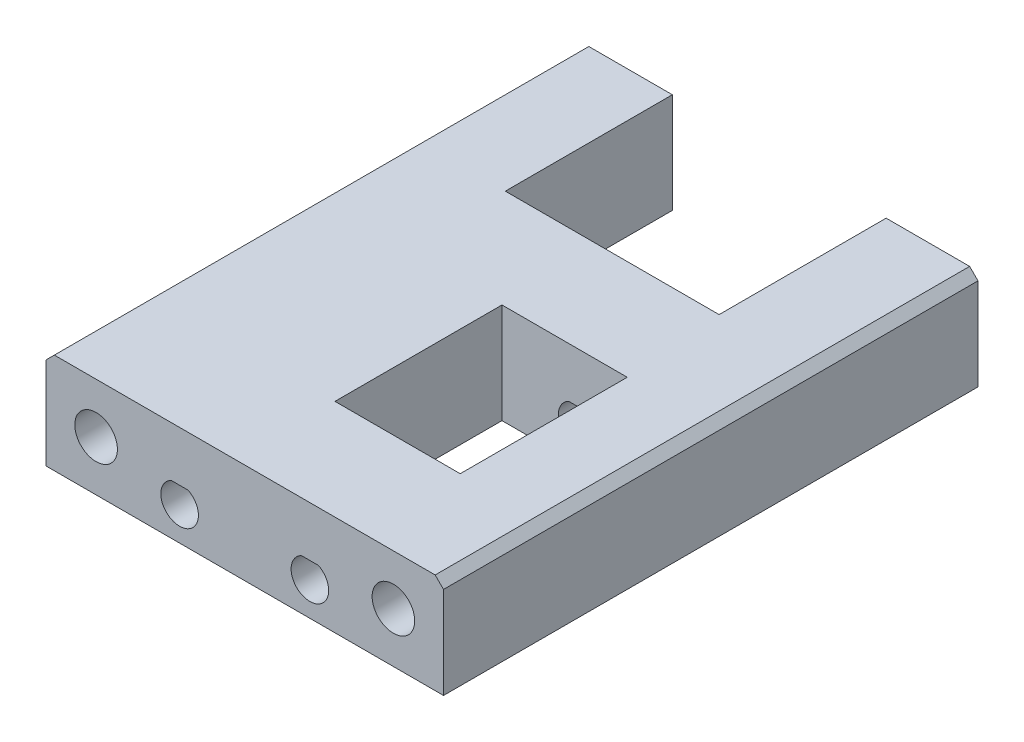
ISO-10303-21;
HEADER;
FILE_DESCRIPTION(('STEP AP214'),'2;1');
FILE_NAME('part.step','',(''),(''),'','','');
FILE_SCHEMA(('AUTOMOTIVE_DESIGN { 1 0 10303 214 1 1 1 1 }'));
ENDSEC;
DATA;
#1=APPLICATION_CONTEXT('core data for automotive mechanical design processes');
#2=APPLICATION_PROTOCOL_DEFINITION('international standard','automotive_design',2000,#1);
#3=PRODUCT_CONTEXT('',#1,'mechanical');
#4=PRODUCT('Part','Part','',(#3));
#5=PRODUCT_RELATED_PRODUCT_CATEGORY('part','',(#4));
#6=PRODUCT_DEFINITION_FORMATION('','',#4);
#7=PRODUCT_DEFINITION_CONTEXT('part definition',#1,'design');
#8=PRODUCT_DEFINITION('design','',#6,#7);
#9=PRODUCT_DEFINITION_SHAPE('','',#8);
#10=(LENGTH_UNIT() NAMED_UNIT(*) SI_UNIT(.MILLI.,.METRE.));
#11=(NAMED_UNIT(*) PLANE_ANGLE_UNIT() SI_UNIT($,.RADIAN.));
#12=(NAMED_UNIT(*) SI_UNIT($,.STERADIAN.) SOLID_ANGLE_UNIT());
#13=UNCERTAINTY_MEASURE_WITH_UNIT(LENGTH_MEASURE(1.E-05),#10,'distance_accuracy_value','');
#14=(GEOMETRIC_REPRESENTATION_CONTEXT(3) GLOBAL_UNCERTAINTY_ASSIGNED_CONTEXT((#13)) GLOBAL_UNIT_ASSIGNED_CONTEXT((#10,
#11,#12)) REPRESENTATION_CONTEXT('',''));
#15=CARTESIAN_POINT('',(0.,0.,0.));
#16=DIRECTION('',(0.,0.,1.));
#17=DIRECTION('',(1.,0.,0.));
#18=AXIS2_PLACEMENT_3D('',#15,#16,#17);
#19=CARTESIAN_POINT('',(8.55,6.,-67.9766609926118));
#20=DIRECTION('',(0.,-1.,0.));
#21=DIRECTION('',(0.,0.,-1.));
#22=AXIS2_PLACEMENT_3D('',#19,#20,#21);
#23=PLANE('',#22);
#24=DIRECTION('',(1.,0.,0.));
#25=VECTOR('',#24,1.);
#26=CARTESIAN_POINT('',(8.54999999999999,6.,12.));
#27=LINE('',#26,#25);
#28=CARTESIAN_POINT('',(30.5692235935956,6.,12.));
#29=VERTEX_POINT('',#28);
#30=CARTESIAN_POINT('',(32.6307764064044,6.,12.));
#31=VERTEX_POINT('',#30);
#32=EDGE_CURVE('E55',#29,#31,#27,.T.);
#33=ORIENTED_EDGE('',*,*,#32,.F.);
#34=DIRECTION('',(0.,0.,1.));
#35=VECTOR('',#34,1.);
#36=CARTESIAN_POINT('',(30.5692235935956,6.,0.));
#37=LINE('',#36,#35);
#38=CARTESIAN_POINT('',(30.5692235935956,6.,0.));
#39=VERTEX_POINT('',#38);
#40=EDGE_CURVE('E266',#29,#39,#37,.F.);
#41=ORIENTED_EDGE('',*,*,#40,.T.);
#42=DIRECTION('',(-1.,0.,0.));
#43=VECTOR('',#42,1.);
#44=CARTESIAN_POINT('',(11.,6.,0.));
#45=LINE('',#44,#43);
#46=CARTESIAN_POINT('',(32.6307764064044,6.00000000000001,0.));
#47=VERTEX_POINT('',#46);
#48=EDGE_CURVE('E221',#47,#39,#45,.T.);
#49=ORIENTED_EDGE('',*,*,#48,.F.);
#50=DIRECTION('',(0.,0.,1.));
#51=VECTOR('',#50,1.);
#52=CARTESIAN_POINT('',(32.6307764064044,6.,0.));
#53=LINE('',#52,#51);
#54=EDGE_CURVE('E273',#47,#31,#53,.T.);
#55=ORIENTED_EDGE('',*,*,#54,.T.);
#56=EDGE_LOOP('',(#33,#41,#49,#55));
#57=FACE_BOUND('',#56,.T.);
#58=ADVANCED_FACE('F33',(#57),#23,.T.);
#59=CARTESIAN_POINT('',(31.6,4.,0.));
#60=DIRECTION('',(0.,0.,1.));
#61=DIRECTION('',(1.,0.,0.));
#62=AXIS2_PLACEMENT_3D('',#59,#60,#61);
#63=CYLINDRICAL_SURFACE('',#62,2.25);
#64=ORIENTED_EDGE('',*,*,#40,.F.);
#65=CARTESIAN_POINT('',(31.6,4.,12.));
#66=DIRECTION('',(0.,0.,-1.));
#67=DIRECTION('',(-1.,0.,0.));
#68=AXIS2_PLACEMENT_3D('',#65,#66,#67);
#69=CIRCLE('',#68,2.25);
#70=EDGE_CURVE('E213',#29,#31,#69,.F.);
#71=ORIENTED_EDGE('',*,*,#70,.T.);
#72=ORIENTED_EDGE('',*,*,#54,.F.);
#73=CARTESIAN_POINT('',(31.6,4.,0.));
#74=DIRECTION('',(0.,0.,1.));
#75=DIRECTION('',(1.,0.,0.));
#76=AXIS2_PLACEMENT_3D('',#73,#74,#75);
#77=CIRCLE('',#76,2.25);
#78=EDGE_CURVE('E303',#39,#47,#77,.T.);
#79=ORIENTED_EDGE('',*,*,#78,.F.);
#80=EDGE_LOOP('',(#64,#71,#72,#79));
#81=FACE_BOUND('',#80,.T.);
#82=ADVANCED_FACE('F394',(#81),#63,.F.);
#83=CARTESIAN_POINT('',(6.,6.,-20.));
#84=DIRECTION('',(0.,0.,-1.));
#85=DIRECTION('',(-1.,0.,0.));
#86=AXIS2_PLACEMENT_3D('',#83,#84,#85);
#87=PLANE('',#86);
#88=CARTESIAN_POINT('',(6.,6.,-20.));
#89=DIRECTION('',(0.,0.,-1.));
#90=DIRECTION('',(-1.,0.,0.));
#91=AXIS2_PLACEMENT_3D('',#88,#89,#90);
#92=CIRCLE('',#91,3.42488663525923);
#93=CARTESIAN_POINT('',(2.57511336474077,6.,-20.));
#94=VERTEX_POINT('',#93);
#95=EDGE_CURVE('E315',#94,#94,#92,.F.);
#96=ORIENTED_EDGE('',*,*,#95,.T.);
#97=EDGE_LOOP('',(#96));
#98=FACE_BOUND('',#97,.T.);
#99=DIRECTION('',(0.,1.,0.));
#100=VECTOR('',#99,1.);
#101=CARTESIAN_POINT('',(0.,0.,-20.));
#102=LINE('',#101,#100);
#103=CARTESIAN_POINT('',(0.,0.,-20.));
#104=VERTEX_POINT('',#103);
#105=CARTESIAN_POINT('',(0.,11.,-20.));
#106=VERTEX_POINT('',#105);
#107=EDGE_CURVE('E255',#104,#106,#102,.T.);
#108=ORIENTED_EDGE('',*,*,#107,.T.);
#109=DIRECTION('',(0.707106781186545,0.70710678118655,0.));
#110=VECTOR('',#109,1.);
#111=CARTESIAN_POINT('',(0.49999999999998,11.5,-20.));
#112=LINE('',#111,#110);
#113=CARTESIAN_POINT('',(0.999999999999994,12.,-20.));
#114=VERTEX_POINT('',#113);
#115=EDGE_CURVE('E332',#106,#114,#112,.T.);
#116=ORIENTED_EDGE('',*,*,#115,.T.);
#117=DIRECTION('',(-1.,0.,0.));
#118=VECTOR('',#117,1.);
#119=CARTESIAN_POINT('',(0.,12.,-20.));
#120=LINE('',#119,#118);
#121=CARTESIAN_POINT('',(11.,12.,-20.));
#122=VERTEX_POINT('',#121);
#123=EDGE_CURVE('E232',#122,#114,#120,.T.);
#124=ORIENTED_EDGE('',*,*,#123,.F.);
#125=DIRECTION('',(0.,-1.,0.));
#126=VECTOR('',#125,1.);
#127=CARTESIAN_POINT('',(11.,6.,-20.));
#128=LINE('',#127,#126);
#129=CARTESIAN_POINT('',(11.,0.,-20.));
#130=VERTEX_POINT('',#129);
#131=EDGE_CURVE('E250',#122,#130,#128,.T.);
#132=ORIENTED_EDGE('',*,*,#131,.T.);
#133=DIRECTION('',(-1.,0.,0.));
#134=VECTOR('',#133,1.);
#135=CARTESIAN_POINT('',(11.,0.,-20.));
#136=LINE('',#135,#134);
#137=EDGE_CURVE('E252',#130,#104,#136,.T.);
#138=ORIENTED_EDGE('',*,*,#137,.T.);
#139=EDGE_LOOP('',(#108,#116,#124,#132,#138));
#140=FACE_BOUND('',#139,.T.);
#141=ADVANCED_FACE('F369',(#98,#140),#87,.T.);
#142=DIRECTION('',(-1.,0.,0.));
#143=VECTOR('',#142,1.);
#144=CARTESIAN_POINT('',(8.55,6.,32.));
#145=LINE('',#144,#143);
#146=CARTESIAN_POINT('',(32.6307764064044,6.,32.));
#147=VERTEX_POINT('',#146);
#148=CARTESIAN_POINT('',(30.5692235935956,6.,32.));
#149=VERTEX_POINT('',#148);
#150=EDGE_CURVE('E211',#147,#149,#145,.T.);
#151=ORIENTED_EDGE('',*,*,#150,.F.);
#152=CARTESIAN_POINT('',(32.6307764064044,6.,44.));
#153=VERTEX_POINT('',#152);
#154=EDGE_CURVE('E272',#147,#153,#53,.T.);
#155=ORIENTED_EDGE('',*,*,#154,.T.);
#156=DIRECTION('',(1.,0.,0.));
#157=VECTOR('',#156,1.);
#158=CARTESIAN_POINT('',(8.55,6.,44.));
#159=LINE('',#158,#157);
#160=CARTESIAN_POINT('',(30.5692235935956,6.,44.));
#161=VERTEX_POINT('',#160);
#162=EDGE_CURVE('E227',#161,#153,#159,.T.);
#163=ORIENTED_EDGE('',*,*,#162,.F.);
#164=EDGE_CURVE('E269',#161,#149,#37,.F.);
#165=ORIENTED_EDGE('',*,*,#164,.T.);
#166=EDGE_LOOP('',(#151,#155,#163,#165));
#167=FACE_BOUND('',#166,.T.);
#168=ADVANCED_FACE('F390',(#167),#23,.T.);
#169=CARTESIAN_POINT('',(41.6,6.,0.));
#170=DIRECTION('',(0.,0.,1.));
#171=DIRECTION('',(1.,0.,0.));
#172=AXIS2_PLACEMENT_3D('',#169,#170,#171);
#173=PLANE('',#172);
#174=ORIENTED_EDGE('',*,*,#78,.T.);
#175=ORIENTED_EDGE('',*,*,#48,.T.);
#176=EDGE_LOOP('',(#174,#175));
#177=FACE_BOUND('',#176,.T.);
#178=CARTESIAN_POINT('',(16.,4.,0.));
#179=DIRECTION('',(0.,0.,1.));
#180=DIRECTION('',(1.,0.,0.));
#181=AXIS2_PLACEMENT_3D('',#178,#179,#180);
#182=CIRCLE('',#181,2.25);
#183=CARTESIAN_POINT('',(14.9692235935956,6.,0.));
#184=VERTEX_POINT('',#183);
#185=CARTESIAN_POINT('',(17.0307764064044,6.,0.));
#186=VERTEX_POINT('',#185);
#187=EDGE_CURVE('E306',#184,#186,#182,.T.);
#188=ORIENTED_EDGE('',*,*,#187,.T.);
#189=EDGE_CURVE('E216',#186,#184,#45,.T.);
#190=ORIENTED_EDGE('',*,*,#189,.T.);
#191=EDGE_LOOP('',(#188,#190));
#192=FACE_BOUND('',#191,.T.);
#193=DIRECTION('',(0.,1.,0.));
#194=VECTOR('',#193,1.);
#195=CARTESIAN_POINT('',(36.6,6.,0.));
#196=LINE('',#195,#194);
#197=CARTESIAN_POINT('',(36.6,0.,0.));
#198=VERTEX_POINT('',#197);
#199=CARTESIAN_POINT('',(36.6,12.,0.));
#200=VERTEX_POINT('',#199);
#201=EDGE_CURVE('E238',#198,#200,#196,.T.);
#202=ORIENTED_EDGE('',*,*,#201,.F.);
#203=DIRECTION('',(1.,0.,0.));
#204=VECTOR('',#203,1.);
#205=CARTESIAN_POINT('',(0.,0.,0.));
#206=LINE('',#205,#204);
#207=CARTESIAN_POINT('',(11.,0.,0.));
#208=VERTEX_POINT('',#207);
#209=EDGE_CURVE('E282',#208,#198,#206,.T.);
#210=ORIENTED_EDGE('',*,*,#209,.F.);
#211=DIRECTION('',(0.,-1.,0.));
#212=VECTOR('',#211,1.);
#213=CARTESIAN_POINT('',(11.,6.,0.));
#214=LINE('',#213,#212);
#215=CARTESIAN_POINT('',(11.,12.,0.));
#216=VERTEX_POINT('',#215);
#217=EDGE_CURVE('E249',#216,#208,#214,.T.);
#218=ORIENTED_EDGE('',*,*,#217,.F.);
#219=DIRECTION('',(-1.,0.,0.));
#220=VECTOR('',#219,1.);
#221=CARTESIAN_POINT('',(11.,12.,0.));
#222=LINE('',#221,#220);
#223=EDGE_CURVE('E224',#200,#216,#222,.T.);
#224=ORIENTED_EDGE('',*,*,#223,.F.);
#225=EDGE_LOOP('',(#202,#210,#218,#224));
#226=FACE_BOUND('',#225,.T.);
#227=ADVANCED_FACE('F378',(#177,#192,#226),#173,.F.);
#228=CARTESIAN_POINT('',(0.,6.,44.));
#229=DIRECTION('',(1.,0.,0.));
#230=DIRECTION('',(0.,1.,0.));
#231=AXIS2_PLACEMENT_3D('',#228,#229,#230);
#232=PLANE('',#231);
#233=DIRECTION('',(0.,-1.,0.));
#234=VECTOR('',#233,1.);
#235=CARTESIAN_POINT('',(0.,6.,44.));
#236=LINE('',#235,#234);
#237=CARTESIAN_POINT('',(0.,11.,44.));
#238=VERTEX_POINT('',#237);
#239=CARTESIAN_POINT('',(0.,0.,44.));
#240=VERTEX_POINT('',#239);
#241=EDGE_CURVE('E283',#238,#240,#236,.T.);
#242=ORIENTED_EDGE('',*,*,#241,.F.);
#243=DIRECTION('',(0.,0.,-1.));
#244=VECTOR('',#243,1.);
#245=CARTESIAN_POINT('',(0.,11.,-20.));
#246=LINE('',#245,#244);
#247=EDGE_CURVE('E330',#238,#106,#246,.T.);
#248=ORIENTED_EDGE('',*,*,#247,.T.);
#249=ORIENTED_EDGE('',*,*,#107,.F.);
#250=DIRECTION('',(0.,0.,-1.));
#251=VECTOR('',#250,1.);
#252=CARTESIAN_POINT('',(0.,0.,44.));
#253=LINE('',#252,#251);
#254=EDGE_CURVE('E301',#240,#104,#253,.T.);
#255=ORIENTED_EDGE('',*,*,#254,.F.);
#256=EDGE_LOOP('',(#242,#248,#249,#255));
#257=FACE_BOUND('',#256,.T.);
#258=ADVANCED_FACE('F363',(#257),#232,.F.);
#259=CARTESIAN_POINT('',(0.,0.,44.));
#260=DIRECTION('',(0.,1.,0.));
#261=DIRECTION('',(0.,0.,1.));
#262=AXIS2_PLACEMENT_3D('',#259,#260,#261);
#263=PLANE('',#262);
#264=DIRECTION('',(-1.,0.,0.));
#265=VECTOR('',#264,1.);
#266=CARTESIAN_POINT('',(37.6,0.,32.));
#267=LINE('',#266,#265);
#268=CARTESIAN_POINT('',(37.6,0.,32.));
#269=VERTEX_POINT('',#268);
#270=CARTESIAN_POINT('',(22.6,0.,32.));
#271=VERTEX_POINT('',#270);
#272=EDGE_CURVE('E199',#269,#271,#267,.T.);
#273=ORIENTED_EDGE('',*,*,#272,.F.);
#274=DIRECTION('',(0.,0.,1.));
#275=VECTOR('',#274,1.);
#276=CARTESIAN_POINT('',(37.6,0.,12.));
#277=LINE('',#276,#275);
#278=CARTESIAN_POINT('',(37.6,0.,12.));
#279=VERTEX_POINT('',#278);
#280=EDGE_CURVE('E48',#279,#269,#277,.T.);
#281=ORIENTED_EDGE('',*,*,#280,.F.);
#282=DIRECTION('',(1.,0.,0.));
#283=VECTOR('',#282,1.);
#284=CARTESIAN_POINT('',(37.6,0.,12.));
#285=LINE('',#284,#283);
#286=CARTESIAN_POINT('',(22.6,0.,12.));
#287=VERTEX_POINT('',#286);
#288=EDGE_CURVE('E190',#287,#279,#285,.T.);
#289=ORIENTED_EDGE('',*,*,#288,.F.);
#290=DIRECTION('',(0.,0.,-1.));
#291=VECTOR('',#290,1.);
#292=CARTESIAN_POINT('',(22.6,0.,12.));
#293=LINE('',#292,#291);
#294=EDGE_CURVE('E193',#271,#287,#293,.T.);
#295=ORIENTED_EDGE('',*,*,#294,.F.);
#296=EDGE_LOOP('',(#273,#281,#289,#295));
#297=FACE_BOUND('',#296,.T.);
#298=ORIENTED_EDGE('',*,*,#254,.T.);
#299=ORIENTED_EDGE('',*,*,#137,.F.);
#300=DIRECTION('',(0.,0.,1.));
#301=VECTOR('',#300,1.);
#302=CARTESIAN_POINT('',(11.,0.,-20.));
#303=LINE('',#302,#301);
#304=EDGE_CURVE('E258',#130,#208,#303,.T.);
#305=ORIENTED_EDGE('',*,*,#304,.T.);
#306=ORIENTED_EDGE('',*,*,#209,.T.);
#307=DIRECTION('',(0.,0.,1.));
#308=VECTOR('',#307,1.);
#309=CARTESIAN_POINT('',(36.6,0.,-20.));
#310=LINE('',#309,#308);
#311=CARTESIAN_POINT('',(36.6,0.,-20.));
#312=VERTEX_POINT('',#311);
#313=EDGE_CURVE('E246',#312,#198,#310,.T.);
#314=ORIENTED_EDGE('',*,*,#313,.F.);
#315=DIRECTION('',(-1.,0.,0.));
#316=VECTOR('',#315,1.);
#317=CARTESIAN_POINT('',(36.6,0.,-20.));
#318=LINE('',#317,#316);
#319=CARTESIAN_POINT('',(47.6,0.,-20.));
#320=VERTEX_POINT('',#319);
#321=EDGE_CURVE('E241',#320,#312,#318,.T.);
#322=ORIENTED_EDGE('',*,*,#321,.F.);
#323=DIRECTION('',(0.,0.,-1.));
#324=VECTOR('',#323,1.);
#325=CARTESIAN_POINT('',(47.6,0.,44.));
#326=LINE('',#325,#324);
#327=CARTESIAN_POINT('',(47.6,0.,44.));
#328=VERTEX_POINT('',#327);
#329=EDGE_CURVE('E296',#328,#320,#326,.T.);
#330=ORIENTED_EDGE('',*,*,#329,.F.);
#331=DIRECTION('',(1.,0.,0.));
#332=VECTOR('',#331,1.);
#333=CARTESIAN_POINT('',(0.,0.,44.));
#334=LINE('',#333,#332);
#335=EDGE_CURVE('E285',#240,#328,#334,.T.);
#336=ORIENTED_EDGE('',*,*,#335,.F.);
#337=EDGE_LOOP('',(#298,#299,#305,#306,#314,#322,#330,#336));
#338=FACE_BOUND('',#337,.T.);
#339=ADVANCED_FACE('F350',(#297,#338),#263,.F.);
#340=CARTESIAN_POINT('',(47.6,0.,44.));
#341=DIRECTION('',(-1.,0.,0.));
#342=DIRECTION('',(0.,0.,1.));
#343=AXIS2_PLACEMENT_3D('',#340,#341,#342);
#344=PLANE('',#343);
#345=DIRECTION('',(0.,-1.,0.));
#346=VECTOR('',#345,1.);
#347=CARTESIAN_POINT('',(47.6,0.,-20.));
#348=LINE('',#347,#346);
#349=CARTESIAN_POINT('',(47.6,11.,-20.));
#350=VERTEX_POINT('',#349);
#351=EDGE_CURVE('E239',#350,#320,#348,.T.);
#352=ORIENTED_EDGE('',*,*,#351,.F.);
#353=DIRECTION('',(0.,0.,1.));
#354=VECTOR('',#353,1.);
#355=CARTESIAN_POINT('',(47.6,11.,44.));
#356=LINE('',#355,#354);
#357=CARTESIAN_POINT('',(47.6,11.,44.));
#358=VERTEX_POINT('',#357);
#359=EDGE_CURVE('E41',#350,#358,#356,.T.);
#360=ORIENTED_EDGE('',*,*,#359,.T.);
#361=DIRECTION('',(0.,1.,0.));
#362=VECTOR('',#361,1.);
#363=CARTESIAN_POINT('',(47.6,0.,44.));
#364=LINE('',#363,#362);
#365=EDGE_CURVE('E287',#328,#358,#364,.T.);
#366=ORIENTED_EDGE('',*,*,#365,.F.);
#367=ORIENTED_EDGE('',*,*,#329,.T.);
#368=EDGE_LOOP('',(#352,#360,#366,#367));
#369=FACE_BOUND('',#368,.T.);
#370=ADVANCED_FACE('F338',(#369),#344,.F.);
#371=CARTESIAN_POINT('',(41.6,6.,44.));
#372=DIRECTION('',(0.,0.,-1.));
#373=DIRECTION('',(-1.,0.,0.));
#374=AXIS2_PLACEMENT_3D('',#371,#372,#373);
#375=CYLINDRICAL_SURFACE('',#374,2.55);
#376=CARTESIAN_POINT('',(41.6,6.,-9.99999999999976));
#377=DIRECTION('',(0.,0.,-1.));
#378=DIRECTION('',(-1.,0.,0.));
#379=AXIS2_PLACEMENT_3D('',#376,#377,#378);
#380=CIRCLE('',#379,2.55);
#381=CARTESIAN_POINT('',(39.05,6.,-9.99999999999976));
#382=VERTEX_POINT('',#381);
#383=EDGE_CURVE('E312',#382,#382,#380,.T.);
#384=ORIENTED_EDGE('',*,*,#383,.T.);
#385=EDGE_LOOP('',(#384));
#386=FACE_BOUND('',#385,.T.);
#387=CARTESIAN_POINT('',(41.6,6.,44.));
#388=DIRECTION('',(0.,0.,-1.));
#389=DIRECTION('',(1.,0.,0.));
#390=AXIS2_PLACEMENT_3D('',#387,#388,#389);
#391=CIRCLE('',#390,2.55);
#392=CARTESIAN_POINT('',(44.15,6.,44.));
#393=VERTEX_POINT('',#392);
#394=EDGE_CURVE('E290',#393,#393,#391,.T.);
#395=ORIENTED_EDGE('',*,*,#394,.F.);
#396=EDGE_LOOP('',(#395));
#397=FACE_BOUND('',#396,.T.);
#398=ADVANCED_FACE('F426',(#386,#397),#375,.F.);
#399=CARTESIAN_POINT('',(6.,6.,44.));
#400=DIRECTION('',(0.,0.,-1.));
#401=DIRECTION('',(-1.,0.,0.));
#402=AXIS2_PLACEMENT_3D('',#399,#400,#401);
#403=CYLINDRICAL_SURFACE('',#402,2.55);
#404=CARTESIAN_POINT('',(6.,6.,-9.99999999999977));
#405=DIRECTION('',(0.,0.,-1.));
#406=DIRECTION('',(-1.,0.,0.));
#407=AXIS2_PLACEMENT_3D('',#404,#405,#406);
#408=CIRCLE('',#407,2.55);
#409=CARTESIAN_POINT('',(3.45,6.,-9.99999999999977));
#410=VERTEX_POINT('',#409);
#411=EDGE_CURVE('E318',#410,#410,#408,.T.);
#412=ORIENTED_EDGE('',*,*,#411,.T.);
#413=EDGE_LOOP('',(#412));
#414=FACE_BOUND('',#413,.T.);
#415=CARTESIAN_POINT('',(6.,6.,44.));
#416=DIRECTION('',(0.,0.,-1.));
#417=DIRECTION('',(1.,0.,0.));
#418=AXIS2_PLACEMENT_3D('',#415,#416,#417);
#419=CIRCLE('',#418,2.55);
#420=CARTESIAN_POINT('',(8.55,6.,44.));
#421=VERTEX_POINT('',#420);
#422=EDGE_CURVE('E293',#421,#421,#419,.T.);
#423=ORIENTED_EDGE('',*,*,#422,.F.);
#424=EDGE_LOOP('',(#423));
#425=FACE_BOUND('',#424,.T.);
#426=ADVANCED_FACE('F421',(#414,#425),#403,.F.);
#427=CARTESIAN_POINT('',(41.6,6.,44.));
#428=DIRECTION('',(0.,0.,1.));
#429=DIRECTION('',(1.,0.,0.));
#430=AXIS2_PLACEMENT_3D('',#427,#428,#429);
#431=PLANE('',#430);
#432=ORIENTED_EDGE('',*,*,#422,.T.);
#433=EDGE_LOOP('',(#432));
#434=FACE_BOUND('',#433,.T.);
#435=CARTESIAN_POINT('',(14.9692235935956,6.,44.));
#436=VERTEX_POINT('',#435);
#437=CARTESIAN_POINT('',(17.0307764064044,6.,44.));
#438=VERTEX_POINT('',#437);
#439=EDGE_CURVE('E233',#436,#438,#159,.T.);
#440=ORIENTED_EDGE('',*,*,#439,.T.);
#441=CARTESIAN_POINT('',(16.,4.,44.));
#442=DIRECTION('',(0.,0.,1.));
#443=DIRECTION('',(1.,0.,0.));
#444=AXIS2_PLACEMENT_3D('',#441,#442,#443);
#445=CIRCLE('',#444,2.25);
#446=EDGE_CURVE('E264',#436,#438,#445,.T.);
#447=ORIENTED_EDGE('',*,*,#446,.F.);
#448=EDGE_LOOP('',(#440,#447));
#449=FACE_BOUND('',#448,.T.);
#450=ORIENTED_EDGE('',*,*,#162,.T.);
#451=CARTESIAN_POINT('',(31.6,4.,44.));
#452=DIRECTION('',(0.,0.,1.));
#453=DIRECTION('',(1.,0.,0.));
#454=AXIS2_PLACEMENT_3D('',#451,#452,#453);
#455=CIRCLE('',#454,2.25);
#456=EDGE_CURVE('E263',#161,#153,#455,.T.);
#457=ORIENTED_EDGE('',*,*,#456,.F.);
#458=EDGE_LOOP('',(#450,#457));
#459=FACE_BOUND('',#458,.T.);
#460=ORIENTED_EDGE('',*,*,#394,.T.);
#461=EDGE_LOOP('',(#460));
#462=FACE_BOUND('',#461,.T.);
#463=DIRECTION('',(-1.,0.,0.));
#464=VECTOR('',#463,1.);
#465=CARTESIAN_POINT('',(0.,12.,44.));
#466=LINE('',#465,#464);
#467=CARTESIAN_POINT('',(46.6,12.,44.));
#468=VERTEX_POINT('',#467);
#469=CARTESIAN_POINT('',(0.999999999999994,12.,44.));
#470=VERTEX_POINT('',#469);
#471=EDGE_CURVE('E229',#468,#470,#466,.T.);
#472=ORIENTED_EDGE('',*,*,#471,.T.);
#473=DIRECTION('',(-0.707106781186545,-0.70710678118655,0.));
#474=VECTOR('',#473,1.);
#475=CARTESIAN_POINT('',(18.2999999999999,29.3,44.));
#476=LINE('',#475,#474);
#477=EDGE_CURVE('E328',#470,#238,#476,.T.);
#478=ORIENTED_EDGE('',*,*,#477,.T.);
#479=ORIENTED_EDGE('',*,*,#241,.T.);
#480=ORIENTED_EDGE('',*,*,#335,.T.);
#481=ORIENTED_EDGE('',*,*,#365,.T.);
#482=DIRECTION('',(-0.70710678118655,0.707106781186545,0.));
#483=VECTOR('',#482,1.);
#484=CARTESIAN_POINT('',(47.1,11.5,44.));
#485=LINE('',#484,#483);
#486=EDGE_CURVE('E326',#358,#468,#485,.T.);
#487=ORIENTED_EDGE('',*,*,#486,.T.);
#488=EDGE_LOOP('',(#472,#478,#479,#480,#481,#487));
#489=FACE_BOUND('',#488,.T.);
#490=ADVANCED_FACE('F342',(#434,#449,#459,#462,#489),#431,.T.);
#491=ORIENTED_EDGE('',*,*,#154,.F.);
#492=CARTESIAN_POINT('',(31.6,4.,32.));
#493=DIRECTION('',(0.,0.,1.));
#494=DIRECTION('',(1.,0.,0.));
#495=AXIS2_PLACEMENT_3D('',#492,#493,#494);
#496=CIRCLE('',#495,2.25);
#497=EDGE_CURVE('E205',#147,#149,#496,.F.);
#498=ORIENTED_EDGE('',*,*,#497,.T.);
#499=ORIENTED_EDGE('',*,*,#164,.F.);
#500=ORIENTED_EDGE('',*,*,#456,.T.);
#501=EDGE_LOOP('',(#491,#498,#499,#500));
#502=FACE_BOUND('',#501,.T.);
#503=ADVANCED_FACE('F401',(#502),#63,.F.);
#504=CARTESIAN_POINT('',(16.,4.,0.));
#505=DIRECTION('',(0.,0.,1.));
#506=DIRECTION('',(1.,0.,0.));
#507=AXIS2_PLACEMENT_3D('',#504,#505,#506);
#508=CYLINDRICAL_SURFACE('',#507,2.25);
#509=ORIENTED_EDGE('',*,*,#187,.F.);
#510=DIRECTION('',(0.,0.,1.));
#511=VECTOR('',#510,1.);
#512=CARTESIAN_POINT('',(14.9692235935956,6.,0.));
#513=LINE('',#512,#511);
#514=EDGE_CURVE('E276',#436,#184,#513,.F.);
#515=ORIENTED_EDGE('',*,*,#514,.F.);
#516=ORIENTED_EDGE('',*,*,#446,.T.);
#517=DIRECTION('',(0.,0.,1.));
#518=VECTOR('',#517,1.);
#519=CARTESIAN_POINT('',(17.0307764064044,6.,0.));
#520=LINE('',#519,#518);
#521=EDGE_CURVE('E279',#186,#438,#520,.T.);
#522=ORIENTED_EDGE('',*,*,#521,.F.);
#523=EDGE_LOOP('',(#509,#515,#516,#522));
#524=FACE_BOUND('',#523,.T.);
#525=ADVANCED_FACE('F559',(#524),#508,.F.);
#526=CARTESIAN_POINT('',(11.,6.,-20.));
#527=DIRECTION('',(-1.,0.,0.));
#528=DIRECTION('',(0.,-1.,0.));
#529=AXIS2_PLACEMENT_3D('',#526,#527,#528);
#530=PLANE('',#529);
#531=ORIENTED_EDGE('',*,*,#217,.T.);
#532=ORIENTED_EDGE('',*,*,#304,.F.);
#533=ORIENTED_EDGE('',*,*,#131,.F.);
#534=DIRECTION('',(0.,0.,-1.));
#535=VECTOR('',#534,1.);
#536=CARTESIAN_POINT('',(11.,12.,0.));
#537=LINE('',#536,#535);
#538=EDGE_CURVE('E217',#216,#122,#537,.T.);
#539=ORIENTED_EDGE('',*,*,#538,.F.);
#540=EDGE_LOOP('',(#531,#532,#533,#539));
#541=FACE_BOUND('',#540,.T.);
#542=ADVANCED_FACE('F373',(#541),#530,.F.);
#543=CARTESIAN_POINT('',(41.6,6.,-20.));
#544=DIRECTION('',(0.,0.,-1.));
#545=DIRECTION('',(-1.,0.,0.));
#546=AXIS2_PLACEMENT_3D('',#543,#544,#545);
#547=CIRCLE('',#546,3.42488663525923);
#548=CARTESIAN_POINT('',(38.1751133647408,6.,-20.));
#549=VERTEX_POINT('',#548);
#550=EDGE_CURVE('E309',#549,#549,#547,.F.);
#551=ORIENTED_EDGE('',*,*,#550,.T.);
#552=EDGE_LOOP('',(#551));
#553=FACE_BOUND('',#552,.T.);
#554=CARTESIAN_POINT('',(46.6,12.,-20.));
#555=VERTEX_POINT('',#554);
#556=CARTESIAN_POINT('',(36.6,12.,-20.));
#557=VERTEX_POINT('',#556);
#558=EDGE_CURVE('E236',#555,#557,#120,.T.);
#559=ORIENTED_EDGE('',*,*,#558,.F.);
#560=DIRECTION('',(0.70710678118655,-0.707106781186545,0.));
#561=VECTOR('',#560,1.);
#562=CARTESIAN_POINT('',(29.2999999999999,29.3,-20.));
#563=LINE('',#562,#561);
#564=EDGE_CURVE('E11',#555,#350,#563,.T.);
#565=ORIENTED_EDGE('',*,*,#564,.T.);
#566=ORIENTED_EDGE('',*,*,#351,.T.);
#567=ORIENTED_EDGE('',*,*,#321,.T.);
#568=DIRECTION('',(0.,1.,0.));
#569=VECTOR('',#568,1.);
#570=CARTESIAN_POINT('',(36.6,6.,-20.));
#571=LINE('',#570,#569);
#572=EDGE_CURVE('E243',#312,#557,#571,.T.);
#573=ORIENTED_EDGE('',*,*,#572,.T.);
#574=EDGE_LOOP('',(#559,#565,#566,#567,#573));
#575=FACE_BOUND('',#574,.T.);
#576=ADVANCED_FACE('F355',(#553,#575),#87,.T.);
#577=CARTESIAN_POINT('',(36.6,6.,-20.));
#578=DIRECTION('',(1.,0.,0.));
#579=DIRECTION('',(0.,0.,-1.));
#580=AXIS2_PLACEMENT_3D('',#577,#578,#579);
#581=PLANE('',#580);
#582=ORIENTED_EDGE('',*,*,#201,.T.);
#583=DIRECTION('',(0.,0.,1.));
#584=VECTOR('',#583,1.);
#585=CARTESIAN_POINT('',(36.6,12.,0.));
#586=LINE('',#585,#584);
#587=EDGE_CURVE('E220',#557,#200,#586,.T.);
#588=ORIENTED_EDGE('',*,*,#587,.F.);
#589=ORIENTED_EDGE('',*,*,#572,.F.);
#590=ORIENTED_EDGE('',*,*,#313,.T.);
#591=EDGE_LOOP('',(#582,#588,#589,#590));
#592=FACE_BOUND('',#591,.T.);
#593=ADVANCED_FACE('F380',(#592),#581,.F.);
#594=ORIENTED_EDGE('',*,*,#189,.F.);
#595=ORIENTED_EDGE('',*,*,#521,.T.);
#596=ORIENTED_EDGE('',*,*,#439,.F.);
#597=ORIENTED_EDGE('',*,*,#514,.T.);
#598=EDGE_LOOP('',(#594,#595,#596,#597));
#599=FACE_BOUND('',#598,.T.);
#600=ADVANCED_FACE('F382',(#599),#23,.T.);
#601=CARTESIAN_POINT('',(0.,12.,-67.9766609926118));
#602=DIRECTION('',(0.,1.,0.));
#603=DIRECTION('',(0.,0.,1.));
#604=AXIS2_PLACEMENT_3D('',#601,#602,#603);
#605=PLANE('',#604);
#606=DIRECTION('',(0.,0.,1.));
#607=VECTOR('',#606,1.);
#608=CARTESIAN_POINT('',(37.6,12.,12.));
#609=LINE('',#608,#607);
#610=CARTESIAN_POINT('',(37.6,12.,12.));
#611=VERTEX_POINT('',#610);
#612=CARTESIAN_POINT('',(37.6,12.,32.));
#613=VERTEX_POINT('',#612);
#614=EDGE_CURVE('E171',#611,#613,#609,.T.);
#615=ORIENTED_EDGE('',*,*,#614,.T.);
#616=DIRECTION('',(-1.,0.,0.));
#617=VECTOR('',#616,1.);
#618=CARTESIAN_POINT('',(37.6,12.,32.));
#619=LINE('',#618,#617);
#620=CARTESIAN_POINT('',(22.6,12.,32.));
#621=VERTEX_POINT('',#620);
#622=EDGE_CURVE('E181',#613,#621,#619,.T.);
#623=ORIENTED_EDGE('',*,*,#622,.T.);
#624=DIRECTION('',(0.,0.,-1.));
#625=VECTOR('',#624,1.);
#626=CARTESIAN_POINT('',(22.6,12.,12.));
#627=LINE('',#626,#625);
#628=CARTESIAN_POINT('',(22.6,12.,12.));
#629=VERTEX_POINT('',#628);
#630=EDGE_CURVE('E185',#621,#629,#627,.T.);
#631=ORIENTED_EDGE('',*,*,#630,.T.);
#632=DIRECTION('',(1.,0.,0.));
#633=VECTOR('',#632,1.);
#634=CARTESIAN_POINT('',(37.6,12.,12.));
#635=LINE('',#634,#633);
#636=EDGE_CURVE('E177',#629,#611,#635,.T.);
#637=ORIENTED_EDGE('',*,*,#636,.T.);
#638=EDGE_LOOP('',(#615,#623,#631,#637));
#639=FACE_BOUND('',#638,.T.);
#640=ORIENTED_EDGE('',*,*,#123,.T.);
#641=DIRECTION('',(0.,0.,1.));
#642=VECTOR('',#641,1.);
#643=CARTESIAN_POINT('',(0.999999999999994,12.,44.));
#644=LINE('',#643,#642);
#645=EDGE_CURVE('E323',#114,#470,#644,.T.);
#646=ORIENTED_EDGE('',*,*,#645,.T.);
#647=ORIENTED_EDGE('',*,*,#471,.F.);
#648=DIRECTION('',(0.,0.,-1.));
#649=VECTOR('',#648,1.);
#650=CARTESIAN_POINT('',(46.6,12.,-20.));
#651=LINE('',#650,#649);
#652=EDGE_CURVE('E321',#468,#555,#651,.T.);
#653=ORIENTED_EDGE('',*,*,#652,.T.);
#654=ORIENTED_EDGE('',*,*,#558,.T.);
#655=ORIENTED_EDGE('',*,*,#587,.T.);
#656=ORIENTED_EDGE('',*,*,#223,.T.);
#657=ORIENTED_EDGE('',*,*,#538,.T.);
#658=EDGE_LOOP('',(#640,#646,#647,#653,#654,#655,#656,#657));
#659=FACE_BOUND('',#658,.T.);
#660=ADVANCED_FACE('F187',(#639,#659),#605,.T.);
#661=CARTESIAN_POINT('',(41.6,6.,-20.));
#662=DIRECTION('',(0.,0.,-1.));
#663=DIRECTION('',(-1.,0.,0.));
#664=AXIS2_PLACEMENT_3D('',#661,#662,#663);
#665=CONICAL_SURFACE('',#664,3.42488663525923,0.0872664625997136);
#666=ORIENTED_EDGE('',*,*,#383,.F.);
#667=EDGE_LOOP('',(#666));
#668=FACE_BOUND('',#667,.T.);
#669=ORIENTED_EDGE('',*,*,#550,.F.);
#670=EDGE_LOOP('',(#669));
#671=FACE_BOUND('',#670,.T.);
#672=ADVANCED_FACE('F443',(#668,#671),#665,.F.);
#673=CARTESIAN_POINT('',(6.,6.,-20.));
#674=DIRECTION('',(0.,0.,-1.));
#675=DIRECTION('',(-1.,0.,0.));
#676=AXIS2_PLACEMENT_3D('',#673,#674,#675);
#677=CONICAL_SURFACE('',#676,3.42488663525923,0.0872664625997134);
#678=ORIENTED_EDGE('',*,*,#411,.F.);
#679=EDGE_LOOP('',(#678));
#680=FACE_BOUND('',#679,.T.);
#681=ORIENTED_EDGE('',*,*,#95,.F.);
#682=EDGE_LOOP('',(#681));
#683=FACE_BOUND('',#682,.T.);
#684=ADVANCED_FACE('F446',(#680,#683),#677,.F.);
#685=CARTESIAN_POINT('',(0.999999999999994,12.,-67.9766609926118));
#686=DIRECTION('',(-0.70710678118655,0.707106781186545,0.));
#687=DIRECTION('',(0.,0.,-1.));
#688=AXIS2_PLACEMENT_3D('',#685,#686,#687);
#689=PLANE('',#688);
#690=ORIENTED_EDGE('',*,*,#115,.F.);
#691=ORIENTED_EDGE('',*,*,#247,.F.);
#692=ORIENTED_EDGE('',*,*,#477,.F.);
#693=ORIENTED_EDGE('',*,*,#645,.F.);
#694=EDGE_LOOP('',(#690,#691,#692,#693));
#695=FACE_BOUND('',#694,.T.);
#696=ADVANCED_FACE('F366',(#695),#689,.T.);
#697=CARTESIAN_POINT('',(47.6,11.,44.));
#698=DIRECTION('',(0.707106781186545,0.70710678118655,0.));
#699=DIRECTION('',(0.,0.,-1.));
#700=AXIS2_PLACEMENT_3D('',#697,#698,#699);
#701=PLANE('',#700);
#702=ORIENTED_EDGE('',*,*,#564,.F.);
#703=ORIENTED_EDGE('',*,*,#652,.F.);
#704=ORIENTED_EDGE('',*,*,#486,.F.);
#705=ORIENTED_EDGE('',*,*,#359,.F.);
#706=EDGE_LOOP('',(#702,#703,#704,#705));
#707=FACE_BOUND('',#706,.T.);
#708=ADVANCED_FACE('F35',(#707),#701,.T.);
#709=CARTESIAN_POINT('',(37.6,12.,12.));
#710=DIRECTION('',(1.,0.,0.));
#711=DIRECTION('',(0.,0.,-1.));
#712=AXIS2_PLACEMENT_3D('',#709,#710,#711);
#713=PLANE('',#712);
#714=ORIENTED_EDGE('',*,*,#280,.T.);
#715=DIRECTION('',(0.,-1.,0.));
#716=VECTOR('',#715,1.);
#717=CARTESIAN_POINT('',(37.6,12.,32.));
#718=LINE('',#717,#716);
#719=EDGE_CURVE('E167',#613,#269,#718,.T.);
#720=ORIENTED_EDGE('',*,*,#719,.F.);
#721=ORIENTED_EDGE('',*,*,#614,.F.);
#722=DIRECTION('',(0.,-1.,0.));
#723=VECTOR('',#722,1.);
#724=CARTESIAN_POINT('',(37.6,12.,12.));
#725=LINE('',#724,#723);
#726=EDGE_CURVE('E203',#611,#279,#725,.T.);
#727=ORIENTED_EDGE('',*,*,#726,.T.);
#728=EDGE_LOOP('',(#714,#720,#721,#727));
#729=FACE_BOUND('',#728,.T.);
#730=ADVANCED_FACE('F169',(#729),#713,.F.);
#731=CARTESIAN_POINT('',(37.6,12.,12.));
#732=DIRECTION('',(0.,0.,-1.));
#733=DIRECTION('',(-1.,0.,0.));
#734=AXIS2_PLACEMENT_3D('',#731,#732,#733);
#735=PLANE('',#734);
#736=ORIENTED_EDGE('',*,*,#32,.T.);
#737=ORIENTED_EDGE('',*,*,#70,.F.);
#738=EDGE_LOOP('',(#736,#737));
#739=FACE_BOUND('',#738,.T.);
#740=ORIENTED_EDGE('',*,*,#288,.T.);
#741=ORIENTED_EDGE('',*,*,#726,.F.);
#742=ORIENTED_EDGE('',*,*,#636,.F.);
#743=DIRECTION('',(0.,-1.,0.));
#744=VECTOR('',#743,1.);
#745=CARTESIAN_POINT('',(22.6,12.,12.));
#746=LINE('',#745,#744);
#747=EDGE_CURVE('E206',#629,#287,#746,.T.);
#748=ORIENTED_EDGE('',*,*,#747,.T.);
#749=EDGE_LOOP('',(#740,#741,#742,#748));
#750=FACE_BOUND('',#749,.T.);
#751=ADVANCED_FACE('F457',(#739,#750),#735,.F.);
#752=CARTESIAN_POINT('',(22.6,12.,12.));
#753=DIRECTION('',(-1.,0.,0.));
#754=DIRECTION('',(0.,0.,1.));
#755=AXIS2_PLACEMENT_3D('',#752,#753,#754);
#756=PLANE('',#755);
#757=ORIENTED_EDGE('',*,*,#294,.T.);
#758=ORIENTED_EDGE('',*,*,#747,.F.);
#759=ORIENTED_EDGE('',*,*,#630,.F.);
#760=DIRECTION('',(0.,-1.,0.));
#761=VECTOR('',#760,1.);
#762=CARTESIAN_POINT('',(22.6,12.,32.));
#763=LINE('',#762,#761);
#764=EDGE_CURVE('E176',#621,#271,#763,.T.);
#765=ORIENTED_EDGE('',*,*,#764,.T.);
#766=EDGE_LOOP('',(#757,#758,#759,#765));
#767=FACE_BOUND('',#766,.T.);
#768=ADVANCED_FACE('F462',(#767),#756,.F.);
#769=CARTESIAN_POINT('',(37.6,12.,32.));
#770=DIRECTION('',(0.,0.,1.));
#771=DIRECTION('',(1.,0.,0.));
#772=AXIS2_PLACEMENT_3D('',#769,#770,#771);
#773=PLANE('',#772);
#774=ORIENTED_EDGE('',*,*,#150,.T.);
#775=ORIENTED_EDGE('',*,*,#497,.F.);
#776=EDGE_LOOP('',(#774,#775));
#777=FACE_BOUND('',#776,.T.);
#778=ORIENTED_EDGE('',*,*,#272,.T.);
#779=ORIENTED_EDGE('',*,*,#764,.F.);
#780=ORIENTED_EDGE('',*,*,#622,.F.);
#781=ORIENTED_EDGE('',*,*,#719,.T.);
#782=EDGE_LOOP('',(#778,#779,#780,#781));
#783=FACE_BOUND('',#782,.T.);
#784=ADVANCED_FACE('F182',(#777,#783),#773,.F.);
#785=CLOSED_SHELL('',(#58,#82,#141,#168,#227,#258,#339,#370,#398,#426,#490,#503,#525,#542,#576,
#593,#600,#660,#672,#684,#696,#708,#730,#751,#768,#784));
#786=MANIFOLD_SOLID_BREP('B2',#785);
#787=ADVANCED_BREP_SHAPE_REPRESENTATION('',(#18,#786),#14);
#788=SHAPE_DEFINITION_REPRESENTATION(#9,#787);
ENDSEC;
END-ISO-10303-21;
